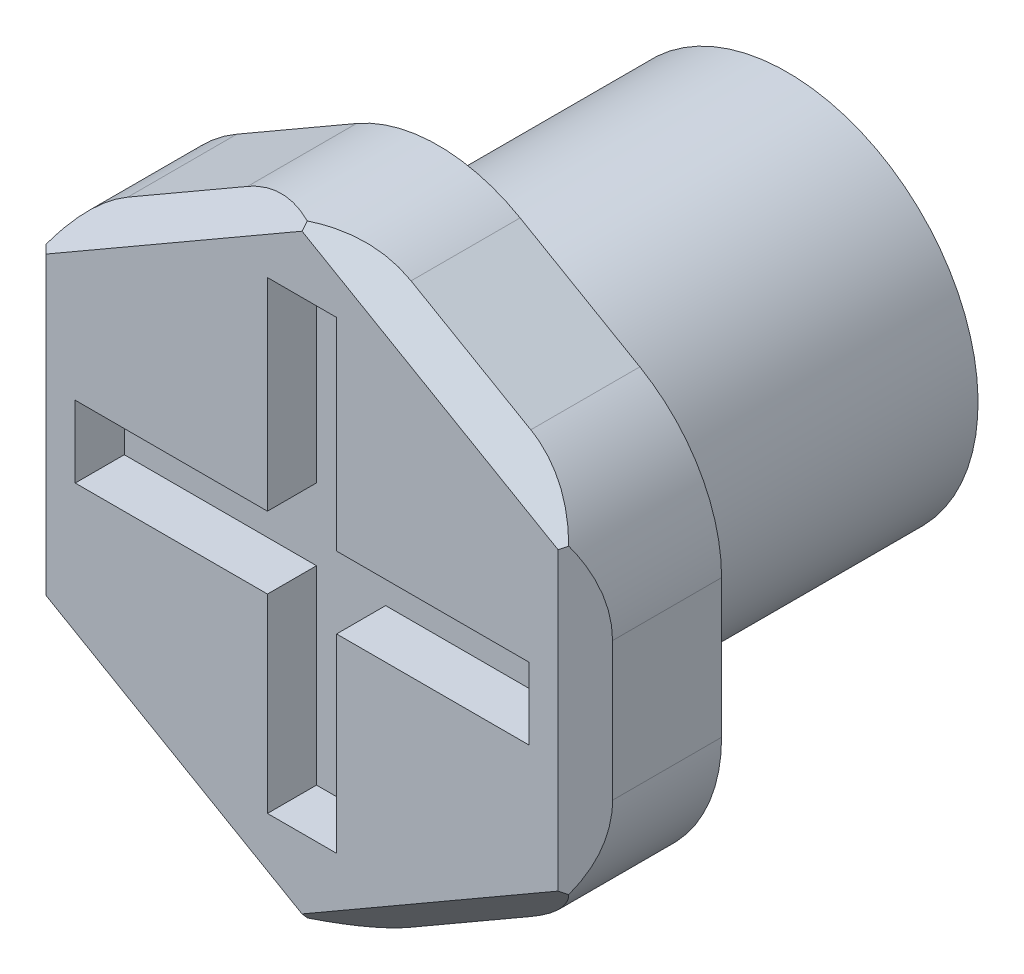
ISO-10303-21;
HEADER;
FILE_DESCRIPTION(('STEP AP214'),'2;1');
FILE_NAME('part.step','',(''),(''),'','','');
FILE_SCHEMA(('AUTOMOTIVE_DESIGN { 1 0 10303 214 1 1 1 1 }'));
ENDSEC;
DATA;
#1=APPLICATION_CONTEXT('core data for automotive mechanical design processes');
#2=APPLICATION_PROTOCOL_DEFINITION('international standard','automotive_design',2000,#1);
#3=PRODUCT_CONTEXT('',#1,'mechanical');
#4=PRODUCT('Part','Part','',(#3));
#5=PRODUCT_RELATED_PRODUCT_CATEGORY('part','',(#4));
#6=PRODUCT_DEFINITION_FORMATION('','',#4);
#7=PRODUCT_DEFINITION_CONTEXT('part definition',#1,'design');
#8=PRODUCT_DEFINITION('design','',#6,#7);
#9=PRODUCT_DEFINITION_SHAPE('','',#8);
#10=(LENGTH_UNIT() NAMED_UNIT(*) SI_UNIT(.MILLI.,.METRE.));
#11=(NAMED_UNIT(*) PLANE_ANGLE_UNIT() SI_UNIT($,.RADIAN.));
#12=(NAMED_UNIT(*) SI_UNIT($,.STERADIAN.) SOLID_ANGLE_UNIT());
#13=UNCERTAINTY_MEASURE_WITH_UNIT(LENGTH_MEASURE(1.E-05),#10,'distance_accuracy_value','');
#14=(GEOMETRIC_REPRESENTATION_CONTEXT(3) GLOBAL_UNCERTAINTY_ASSIGNED_CONTEXT((#13)) GLOBAL_UNIT_ASSIGNED_CONTEXT((#10,
#11,#12)) REPRESENTATION_CONTEXT('',''));
#15=CARTESIAN_POINT('',(0.,0.,0.));
#16=DIRECTION('',(0.,0.,1.));
#17=DIRECTION('',(1.,0.,0.));
#18=AXIS2_PLACEMENT_3D('',#15,#16,#17);
#19=CARTESIAN_POINT('',(-5.2828629166,-5.2618340026,2.032));
#20=DIRECTION('',(0.,0.,1.));
#21=DIRECTION('',(1.,0.,0.));
#22=AXIS2_PLACEMENT_3D('',#19,#20,#21);
#23=PLANE('',#22);
#24=DIRECTION('',(0.,1.,0.));
#25=VECTOR('',#24,1.);
#26=CARTESIAN_POINT('',(-0.8049227234,3.1925308006,2.032));
#27=LINE('',#26,#25);
#28=CARTESIAN_POINT('',(-0.804922722928895,0.835675141292319,2.032));
#29=VERTEX_POINT('',#28);
#30=CARTESIAN_POINT('',(-0.804922722928895,5.5493864628,2.032));
#31=VERTEX_POINT('',#30);
#32=EDGE_CURVE('E239',#29,#31,#27,.T.);
#33=ORIENTED_EDGE('',*,*,#32,.F.);
#34=DIRECTION('',(1.,0.,0.));
#35=VECTOR('',#34,1.);
#36=CARTESIAN_POINT('',(-3.04389282,0.8356751384,2.032));
#37=LINE('',#36,#35);
#38=CARTESIAN_POINT('',(-5.2828629166,0.835675141292319,2.032));
#39=VERTEX_POINT('',#38);
#40=EDGE_CURVE('E237',#39,#29,#37,.T.);
#41=ORIENTED_EDGE('',*,*,#40,.F.);
#42=DIRECTION('',(0.,-1.,0.));
#43=VECTOR('',#42,1.);
#44=CARTESIAN_POINT('',(-5.2828629166,0.,2.032));
#45=LINE('',#44,#43);
#46=CARTESIAN_POINT('',(-5.2828629166,-0.835675136685313,2.032));
#47=VERTEX_POINT('',#46);
#48=EDGE_CURVE('E228',#39,#47,#45,.T.);
#49=ORIENTED_EDGE('',*,*,#48,.T.);
#50=DIRECTION('',(1.,0.,0.));
#51=VECTOR('',#50,1.);
#52=CARTESIAN_POINT('',(-3.04389282,-0.8356751384,2.032));
#53=LINE('',#52,#51);
#54=CARTESIAN_POINT('',(-0.80492272245779,-0.835675134970626,2.032));
#55=VERTEX_POINT('',#54);
#56=EDGE_CURVE('E197',#47,#55,#53,.T.);
#57=ORIENTED_EDGE('',*,*,#56,.T.);
#58=DIRECTION('',(0.,1.,0.));
#59=VECTOR('',#58,1.);
#60=CARTESIAN_POINT('',(-0.8049227234,-3.0487545705,2.032));
#61=LINE('',#60,#59);
#62=CARTESIAN_POINT('',(-0.804922722928895,-5.2618340026,2.032));
#63=VERTEX_POINT('',#62);
#64=EDGE_CURVE('E285',#63,#55,#61,.T.);
#65=ORIENTED_EDGE('',*,*,#64,.F.);
#66=DIRECTION('',(1.,0.,0.));
#67=VECTOR('',#66,1.);
#68=CARTESIAN_POINT('',(0.,-5.2618340026,2.032));
#69=LINE('',#68,#67);
#70=CARTESIAN_POINT('',(0.80492272245779,-5.2618340026,2.032));
#71=VERTEX_POINT('',#70);
#72=EDGE_CURVE('E279',#63,#71,#69,.T.);
#73=ORIENTED_EDGE('',*,*,#72,.T.);
#74=DIRECTION('',(0.,1.,0.));
#75=VECTOR('',#74,1.);
#76=CARTESIAN_POINT('',(0.8049227234,-3.0487545705,2.032));
#77=LINE('',#76,#75);
#78=CARTESIAN_POINT('',(0.80492272245779,-0.835675134970626,2.032));
#79=VERTEX_POINT('',#78);
#80=EDGE_CURVE('E275',#71,#79,#77,.T.);
#81=ORIENTED_EDGE('',*,*,#80,.T.);
#82=DIRECTION('',(1.,0.,0.));
#83=VECTOR('',#82,1.);
#84=CARTESIAN_POINT('',(3.04389282,-0.8356751384,2.032));
#85=LINE('',#84,#83);
#86=CARTESIAN_POINT('',(5.2828629166,-0.835675134970626,2.032));
#87=VERTEX_POINT('',#86);
#88=EDGE_CURVE('E270',#79,#87,#85,.T.);
#89=ORIENTED_EDGE('',*,*,#88,.T.);
#90=DIRECTION('',(0.,-1.,0.));
#91=VECTOR('',#90,1.);
#92=CARTESIAN_POINT('',(5.2828629166,0.,2.032));
#93=LINE('',#92,#91);
#94=CARTESIAN_POINT('',(5.2828629166,0.835675141292319,2.032));
#95=VERTEX_POINT('',#94);
#96=EDGE_CURVE('E267',#95,#87,#93,.T.);
#97=ORIENTED_EDGE('',*,*,#96,.F.);
#98=DIRECTION('',(1.,0.,0.));
#99=VECTOR('',#98,1.);
#100=CARTESIAN_POINT('',(3.04389282,0.8356751384,2.032));
#101=LINE('',#100,#99);
#102=CARTESIAN_POINT('',(0.804922722928895,0.835675141292319,2.032));
#103=VERTEX_POINT('',#102);
#104=EDGE_CURVE('E262',#103,#95,#101,.T.);
#105=ORIENTED_EDGE('',*,*,#104,.F.);
#106=DIRECTION('',(0.,1.,0.));
#107=VECTOR('',#106,1.);
#108=CARTESIAN_POINT('',(0.8049227234,3.1925308006,2.032));
#109=LINE('',#108,#107);
#110=CARTESIAN_POINT('',(0.80492272245779,5.5493864628,2.032));
#111=VERTEX_POINT('',#110);
#112=EDGE_CURVE('E255',#103,#111,#109,.T.);
#113=ORIENTED_EDGE('',*,*,#112,.T.);
#114=DIRECTION('',(1.,0.,0.));
#115=VECTOR('',#114,1.);
#116=CARTESIAN_POINT('',(0.,5.5493864628,2.032));
#117=LINE('',#116,#115);
#118=EDGE_CURVE('E252',#31,#111,#117,.T.);
#119=ORIENTED_EDGE('',*,*,#118,.F.);
#120=EDGE_LOOP('',(#33,#41,#49,#57,#65,#73,#81,#89,#97,#105,#113,#119));
#121=FACE_BOUND('',#120,.T.);
#122=ADVANCED_FACE('F16',(#121),#23,.T.);
#123=CARTESIAN_POINT('',(-5.2828629166,-0.8356751384,2.032));
#124=DIRECTION('',(-1.,0.,0.));
#125=DIRECTION('',(0.,0.,1.));
#126=AXIS2_PLACEMENT_3D('',#123,#124,#125);
#127=PLANE('',#126);
#128=DIRECTION('',(0.,0.,-1.));
#129=VECTOR('',#128,1.);
#130=CARTESIAN_POINT('',(-5.2828629166,-0.8356751384,2.6035));
#131=LINE('',#130,#129);
#132=CARTESIAN_POINT('',(-5.28286291624662,-0.835675138634561,3.175));
#133=VERTEX_POINT('',#132);
#134=EDGE_CURVE('E234',#133,#47,#131,.T.);
#135=ORIENTED_EDGE('',*,*,#134,.T.);
#136=ORIENTED_EDGE('',*,*,#48,.F.);
#137=DIRECTION('',(0.,0.,-1.));
#138=VECTOR('',#137,1.);
#139=CARTESIAN_POINT('',(-5.2828629166,0.8356751384,2.6035));
#140=LINE('',#139,#138);
#141=CARTESIAN_POINT('',(-5.28286291624662,0.835675138634562,3.175));
#142=VERTEX_POINT('',#141);
#143=EDGE_CURVE('E232',#142,#39,#140,.T.);
#144=ORIENTED_EDGE('',*,*,#143,.F.);
#145=DIRECTION('',(0.,1.,0.));
#146=VECTOR('',#145,1.);
#147=CARTESIAN_POINT('',(-5.28286291518647,0.,3.175));
#148=LINE('',#147,#146);
#149=EDGE_CURVE('E190',#133,#142,#148,.T.);
#150=ORIENTED_EDGE('',*,*,#149,.F.);
#151=EDGE_LOOP('',(#135,#136,#144,#150));
#152=FACE_BOUND('',#151,.T.);
#153=ADVANCED_FACE('F230',(#152),#127,.F.);
#154=CARTESIAN_POINT('',(-5.2828629166,0.8356751384,3.175));
#155=DIRECTION('',(0.,-1.,0.));
#156=DIRECTION('',(0.,0.,-1.));
#157=AXIS2_PLACEMENT_3D('',#154,#155,#156);
#158=PLANE('',#157);
#159=ORIENTED_EDGE('',*,*,#40,.T.);
#160=DIRECTION('',(0.,0.,-1.));
#161=VECTOR('',#160,1.);
#162=CARTESIAN_POINT('',(-0.8049227234,0.8356751384,2.6035));
#163=LINE('',#162,#161);
#164=CARTESIAN_POINT('',(-0.804922722562853,0.835675138634562,3.175));
#165=VERTEX_POINT('',#164);
#166=EDGE_CURVE('E242',#165,#29,#163,.T.);
#167=ORIENTED_EDGE('',*,*,#166,.F.);
#168=DIRECTION('',(1.,0.,0.));
#169=VECTOR('',#168,1.);
#170=CARTESIAN_POINT('',(0.,0.835675139338246,3.175));
#171=LINE('',#170,#169);
#172=EDGE_CURVE('E246',#142,#165,#171,.T.);
#173=ORIENTED_EDGE('',*,*,#172,.F.);
#174=ORIENTED_EDGE('',*,*,#143,.T.);
#175=EDGE_LOOP('',(#159,#167,#173,#174));
#176=FACE_BOUND('',#175,.T.);
#177=ADVANCED_FACE('F244',(#176),#158,.T.);
#178=CARTESIAN_POINT('',(-0.8049227234,0.8356751384,3.175));
#179=DIRECTION('',(1.,0.,0.));
#180=DIRECTION('',(0.,0.,-1.));
#181=AXIS2_PLACEMENT_3D('',#178,#179,#180);
#182=PLANE('',#181);
#183=ORIENTED_EDGE('',*,*,#32,.T.);
#184=DIRECTION('',(0.,0.,-1.));
#185=VECTOR('',#184,1.);
#186=CARTESIAN_POINT('',(-0.8049227234,5.5493864628,2.6035));
#187=LINE('',#186,#185);
#188=CARTESIAN_POINT('',(-0.804922722562853,5.54938646227071,3.175));
#189=VERTEX_POINT('',#188);
#190=EDGE_CURVE('E250',#189,#31,#187,.T.);
#191=ORIENTED_EDGE('',*,*,#190,.F.);
#192=DIRECTION('',(0.,1.,0.));
#193=VECTOR('',#192,1.);
#194=CARTESIAN_POINT('',(-0.80492272005141,0.,3.175));
#195=LINE('',#194,#193);
#196=EDGE_CURVE('E319',#165,#189,#195,.T.);
#197=ORIENTED_EDGE('',*,*,#196,.F.);
#198=ORIENTED_EDGE('',*,*,#166,.T.);
#199=EDGE_LOOP('',(#183,#191,#197,#198));
#200=FACE_BOUND('',#199,.T.);
#201=ADVANCED_FACE('F558',(#200),#182,.T.);
#202=CARTESIAN_POINT('',(-0.8049227234,5.5493864628,3.175));
#203=DIRECTION('',(0.,-1.,0.));
#204=DIRECTION('',(0.,0.,-1.));
#205=AXIS2_PLACEMENT_3D('',#202,#203,#204);
#206=PLANE('',#205);
#207=ORIENTED_EDGE('',*,*,#118,.T.);
#208=DIRECTION('',(0.,0.,1.));
#209=VECTOR('',#208,1.);
#210=CARTESIAN_POINT('',(0.8049227234,5.5493864628,2.6035));
#211=LINE('',#210,#209);
#212=CARTESIAN_POINT('',(0.804922722562853,5.54938646227071,3.175));
#213=VERTEX_POINT('',#212);
#214=EDGE_CURVE('E258',#111,#213,#211,.T.);
#215=ORIENTED_EDGE('',*,*,#214,.T.);
#216=DIRECTION('',(1.,0.,0.));
#217=VECTOR('',#216,1.);
#218=CARTESIAN_POINT('',(0.,5.54938646068282,3.175));
#219=LINE('',#218,#217);
#220=EDGE_CURVE('E316',#189,#213,#219,.T.);
#221=ORIENTED_EDGE('',*,*,#220,.F.);
#222=ORIENTED_EDGE('',*,*,#190,.T.);
#223=EDGE_LOOP('',(#207,#215,#221,#222));
#224=FACE_BOUND('',#223,.T.);
#225=ADVANCED_FACE('F561',(#224),#206,.T.);
#226=CARTESIAN_POINT('',(0.8049227234,0.8356751384,3.175));
#227=DIRECTION('',(1.,0.,0.));
#228=DIRECTION('',(0.,0.,-1.));
#229=AXIS2_PLACEMENT_3D('',#226,#227,#228);
#230=PLANE('',#229);
#231=ORIENTED_EDGE('',*,*,#214,.F.);
#232=ORIENTED_EDGE('',*,*,#112,.F.);
#233=DIRECTION('',(0.,0.,-1.));
#234=VECTOR('',#233,1.);
#235=CARTESIAN_POINT('',(0.8049227234,0.8356751384,2.6035));
#236=LINE('',#235,#234);
#237=CARTESIAN_POINT('',(0.804922722562853,0.835675138634562,3.175));
#238=VERTEX_POINT('',#237);
#239=EDGE_CURVE('E260',#238,#103,#236,.T.);
#240=ORIENTED_EDGE('',*,*,#239,.F.);
#241=DIRECTION('',(0.,-1.,0.));
#242=VECTOR('',#241,1.);
#243=CARTESIAN_POINT('',(0.80492272005141,0.,3.175));
#244=LINE('',#243,#242);
#245=EDGE_CURVE('E313',#213,#238,#244,.T.);
#246=ORIENTED_EDGE('',*,*,#245,.F.);
#247=EDGE_LOOP('',(#231,#232,#240,#246));
#248=FACE_BOUND('',#247,.T.);
#249=ADVANCED_FACE('F565',(#248),#230,.F.);
#250=CARTESIAN_POINT('',(0.8049227234,0.8356751384,3.175));
#251=DIRECTION('',(0.,-1.,0.));
#252=DIRECTION('',(0.,0.,-1.));
#253=AXIS2_PLACEMENT_3D('',#250,#251,#252);
#254=PLANE('',#253);
#255=ORIENTED_EDGE('',*,*,#104,.T.);
#256=DIRECTION('',(0.,0.,-1.));
#257=VECTOR('',#256,1.);
#258=CARTESIAN_POINT('',(5.2828629166,0.8356751384,2.6035));
#259=LINE('',#258,#257);
#260=CARTESIAN_POINT('',(5.28286291624662,0.835675138634562,3.175));
#261=VERTEX_POINT('',#260);
#262=EDGE_CURVE('E264',#261,#95,#259,.T.);
#263=ORIENTED_EDGE('',*,*,#262,.F.);
#264=DIRECTION('',(1.,0.,0.));
#265=VECTOR('',#264,1.);
#266=CARTESIAN_POINT('',(0.,0.835675139338246,3.175));
#267=LINE('',#266,#265);
#268=EDGE_CURVE('E310',#238,#261,#267,.T.);
#269=ORIENTED_EDGE('',*,*,#268,.F.);
#270=ORIENTED_EDGE('',*,*,#239,.T.);
#271=EDGE_LOOP('',(#255,#263,#269,#270));
#272=FACE_BOUND('',#271,.T.);
#273=ADVANCED_FACE('F569',(#272),#254,.T.);
#274=CARTESIAN_POINT('',(5.2828629166,-0.8356751384,2.032));
#275=DIRECTION('',(-1.,0.,0.));
#276=DIRECTION('',(0.,0.,1.));
#277=AXIS2_PLACEMENT_3D('',#274,#275,#276);
#278=PLANE('',#277);
#279=ORIENTED_EDGE('',*,*,#96,.T.);
#280=DIRECTION('',(0.,0.,1.));
#281=VECTOR('',#280,1.);
#282=CARTESIAN_POINT('',(5.2828629166,-0.8356751384,2.6035));
#283=LINE('',#282,#281);
#284=CARTESIAN_POINT('',(5.28286291624662,-0.835675138634561,3.175));
#285=VERTEX_POINT('',#284);
#286=EDGE_CURVE('E273',#87,#285,#283,.T.);
#287=ORIENTED_EDGE('',*,*,#286,.T.);
#288=DIRECTION('',(0.,-1.,0.));
#289=VECTOR('',#288,1.);
#290=CARTESIAN_POINT('',(5.28286291518647,0.,3.175));
#291=LINE('',#290,#289);
#292=EDGE_CURVE('E307',#261,#285,#291,.T.);
#293=ORIENTED_EDGE('',*,*,#292,.F.);
#294=ORIENTED_EDGE('',*,*,#262,.T.);
#295=EDGE_LOOP('',(#279,#287,#293,#294));
#296=FACE_BOUND('',#295,.T.);
#297=ADVANCED_FACE('F573',(#296),#278,.T.);
#298=CARTESIAN_POINT('',(0.8049227234,-0.8356751384,3.175));
#299=DIRECTION('',(0.,-1.,0.));
#300=DIRECTION('',(0.,0.,-1.));
#301=AXIS2_PLACEMENT_3D('',#298,#299,#300);
#302=PLANE('',#301);
#303=ORIENTED_EDGE('',*,*,#286,.F.);
#304=ORIENTED_EDGE('',*,*,#88,.F.);
#305=DIRECTION('',(0.,0.,1.));
#306=VECTOR('',#305,1.);
#307=CARTESIAN_POINT('',(0.8049227234,-0.8356751384,2.6035));
#308=LINE('',#307,#306);
#309=CARTESIAN_POINT('',(0.804922722562853,-0.835675138634561,3.175));
#310=VERTEX_POINT('',#309);
#311=EDGE_CURVE('E277',#79,#310,#308,.T.);
#312=ORIENTED_EDGE('',*,*,#311,.T.);
#313=DIRECTION('',(-1.,0.,0.));
#314=VECTOR('',#313,1.);
#315=CARTESIAN_POINT('',(0.,-0.835675139338245,3.175));
#316=LINE('',#315,#314);
#317=EDGE_CURVE('E304',#285,#310,#316,.T.);
#318=ORIENTED_EDGE('',*,*,#317,.F.);
#319=EDGE_LOOP('',(#303,#304,#312,#318));
#320=FACE_BOUND('',#319,.T.);
#321=ADVANCED_FACE('F577',(#320),#302,.F.);
#322=CARTESIAN_POINT('',(0.8049227234,-5.2618340026,3.175));
#323=DIRECTION('',(1.,0.,0.));
#324=DIRECTION('',(0.,0.,-1.));
#325=AXIS2_PLACEMENT_3D('',#322,#323,#324);
#326=PLANE('',#325);
#327=ORIENTED_EDGE('',*,*,#311,.F.);
#328=ORIENTED_EDGE('',*,*,#80,.F.);
#329=DIRECTION('',(0.,0.,1.));
#330=VECTOR('',#329,1.);
#331=CARTESIAN_POINT('',(0.8049227234,-5.2618340026,2.6035));
#332=LINE('',#331,#330);
#333=CARTESIAN_POINT('',(0.804922722562853,-5.26183400597365,3.175));
#334=VERTEX_POINT('',#333);
#335=EDGE_CURVE('E281',#71,#334,#332,.T.);
#336=ORIENTED_EDGE('',*,*,#335,.T.);
#337=DIRECTION('',(0.,-1.,0.));
#338=VECTOR('',#337,1.);
#339=CARTESIAN_POINT('',(0.80492272005141,0.,3.175));
#340=LINE('',#339,#338);
#341=EDGE_CURVE('E301',#310,#334,#340,.T.);
#342=ORIENTED_EDGE('',*,*,#341,.F.);
#343=EDGE_LOOP('',(#327,#328,#336,#342));
#344=FACE_BOUND('',#343,.T.);
#345=ADVANCED_FACE('F581',(#344),#326,.F.);
#346=CARTESIAN_POINT('',(-0.8049227234,-5.2618340026,3.175));
#347=DIRECTION('',(0.,-1.,0.));
#348=DIRECTION('',(0.,0.,-1.));
#349=AXIS2_PLACEMENT_3D('',#346,#347,#348);
#350=PLANE('',#349);
#351=ORIENTED_EDGE('',*,*,#335,.F.);
#352=ORIENTED_EDGE('',*,*,#72,.F.);
#353=DIRECTION('',(0.,0.,-1.));
#354=VECTOR('',#353,1.);
#355=CARTESIAN_POINT('',(-0.8049227234,-5.2618340026,2.6035));
#356=LINE('',#355,#354);
#357=CARTESIAN_POINT('',(-0.804922722562853,-5.26183400597365,3.175));
#358=VERTEX_POINT('',#357);
#359=EDGE_CURVE('E283',#358,#63,#356,.T.);
#360=ORIENTED_EDGE('',*,*,#359,.F.);
#361=DIRECTION('',(-1.,0.,0.));
#362=VECTOR('',#361,1.);
#363=CARTESIAN_POINT('',(0.,-5.26183401609459,3.175));
#364=LINE('',#363,#362);
#365=EDGE_CURVE('E298',#334,#358,#364,.T.);
#366=ORIENTED_EDGE('',*,*,#365,.F.);
#367=EDGE_LOOP('',(#351,#352,#360,#366));
#368=FACE_BOUND('',#367,.T.);
#369=ADVANCED_FACE('F585',(#368),#350,.F.);
#370=CARTESIAN_POINT('',(-0.8049227234,-5.2618340026,3.175));
#371=DIRECTION('',(1.,0.,0.));
#372=DIRECTION('',(0.,0.,-1.));
#373=AXIS2_PLACEMENT_3D('',#370,#371,#372);
#374=PLANE('',#373);
#375=ORIENTED_EDGE('',*,*,#64,.T.);
#376=DIRECTION('',(0.,0.,1.));
#377=VECTOR('',#376,1.);
#378=CARTESIAN_POINT('',(-0.8049227234,-0.8356751384,2.6035));
#379=LINE('',#378,#377);
#380=CARTESIAN_POINT('',(-0.804922722562853,-0.835675138634561,3.175));
#381=VERTEX_POINT('',#380);
#382=EDGE_CURVE('E152',#55,#381,#379,.T.);
#383=ORIENTED_EDGE('',*,*,#382,.T.);
#384=DIRECTION('',(0.,1.,0.));
#385=VECTOR('',#384,1.);
#386=CARTESIAN_POINT('',(-0.80492272005141,0.,3.175));
#387=LINE('',#386,#385);
#388=EDGE_CURVE('E295',#358,#381,#387,.T.);
#389=ORIENTED_EDGE('',*,*,#388,.F.);
#390=ORIENTED_EDGE('',*,*,#359,.T.);
#391=EDGE_LOOP('',(#375,#383,#389,#390));
#392=FACE_BOUND('',#391,.T.);
#393=ADVANCED_FACE('F589',(#392),#374,.T.);
#394=CARTESIAN_POINT('',(-5.2828629166,-0.8356751384,3.175));
#395=DIRECTION('',(0.,-1.,0.));
#396=DIRECTION('',(0.,0.,-1.));
#397=AXIS2_PLACEMENT_3D('',#394,#395,#396);
#398=PLANE('',#397);
#399=ORIENTED_EDGE('',*,*,#382,.F.);
#400=ORIENTED_EDGE('',*,*,#56,.F.);
#401=ORIENTED_EDGE('',*,*,#134,.F.);
#402=DIRECTION('',(-1.,0.,0.));
#403=VECTOR('',#402,1.);
#404=CARTESIAN_POINT('',(0.,-0.835675139338245,3.175));
#405=LINE('',#404,#403);
#406=EDGE_CURVE('E292',#381,#133,#405,.T.);
#407=ORIENTED_EDGE('',*,*,#406,.F.);
#408=EDGE_LOOP('',(#399,#400,#401,#407));
#409=FACE_BOUND('',#408,.T.);
#410=ADVANCED_FACE('F593',(#409),#398,.F.);
#411=CARTESIAN_POINT('',(-5.9641135734,-6.8867651698,3.175));
#412=DIRECTION('',(0.,0.,1.));
#413=DIRECTION('',(1.,0.,0.));
#414=AXIS2_PLACEMENT_3D('',#411,#412,#413);
#415=PLANE('',#414);
#416=ORIENTED_EDGE('',*,*,#388,.T.);
#417=ORIENTED_EDGE('',*,*,#406,.T.);
#418=ORIENTED_EDGE('',*,*,#149,.T.);
#419=ORIENTED_EDGE('',*,*,#172,.T.);
#420=ORIENTED_EDGE('',*,*,#196,.T.);
#421=ORIENTED_EDGE('',*,*,#220,.T.);
#422=ORIENTED_EDGE('',*,*,#245,.T.);
#423=ORIENTED_EDGE('',*,*,#268,.T.);
#424=ORIENTED_EDGE('',*,*,#292,.T.);
#425=ORIENTED_EDGE('',*,*,#317,.T.);
#426=ORIENTED_EDGE('',*,*,#341,.T.);
#427=ORIENTED_EDGE('',*,*,#365,.T.);
#428=EDGE_LOOP('',(#416,#417,#418,#419,#420,#421,#422,#423,#424,#425,#426,#427));
#429=FACE_BOUND('',#428,.T.);
#430=DIRECTION('',(0.,-1.,0.));
#431=VECTOR('',#430,1.);
#432=CARTESIAN_POINT('',(5.9641135734,0.,3.175));
#433=LINE('',#432,#431);
#434=CARTESIAN_POINT('',(5.9641135734,3.44338257355097,3.175));
#435=VERTEX_POINT('',#434);
#436=CARTESIAN_POINT('',(5.9641135734,-3.44338257355097,3.175));
#437=VERTEX_POINT('',#436);
#438=EDGE_CURVE('E392',#435,#437,#433,.T.);
#439=ORIENTED_EDGE('',*,*,#438,.F.);
#440=DIRECTION('',(0.866025404100274,-0.499999999452957,0.));
#441=VECTOR('',#440,1.);
#442=CARTESIAN_POINT('',(2.9820567867,5.1650738583,3.175));
#443=LINE('',#442,#441);
#444=CARTESIAN_POINT('',(1.2009651086109E-09,6.8867651450218,3.175));
#445=VERTEX_POINT('',#444);
#446=EDGE_CURVE('E143',#445,#435,#443,.T.);
#447=ORIENTED_EDGE('',*,*,#446,.F.);
#448=DIRECTION('',(0.866025404100274,0.499999999452957,0.));
#449=VECTOR('',#448,1.);
#450=CARTESIAN_POINT('',(-2.9820567867,5.1650738583,3.175));
#451=LINE('',#450,#449);
#452=CARTESIAN_POINT('',(-5.9641135734,3.44338257355097,3.175));
#453=VERTEX_POINT('',#452);
#454=EDGE_CURVE('E391',#453,#445,#451,.T.);
#455=ORIENTED_EDGE('',*,*,#454,.F.);
#456=DIRECTION('',(0.,1.,0.));
#457=VECTOR('',#456,1.);
#458=CARTESIAN_POINT('',(-5.9641135734,0.,3.175));
#459=LINE('',#458,#457);
#460=CARTESIAN_POINT('',(-5.96411357460097,-3.4433825715782,3.175));
#461=VERTEX_POINT('',#460);
#462=EDGE_CURVE('E406',#461,#453,#459,.T.);
#463=ORIENTED_EDGE('',*,*,#462,.F.);
#464=DIRECTION('',(-0.866025404100274,0.499999999452957,0.));
#465=VECTOR('',#464,1.);
#466=CARTESIAN_POINT('',(-2.9820567867,-5.1650738583,3.175));
#467=LINE('',#466,#465);
#468=CARTESIAN_POINT('',(-1.2009651086109E-09,-6.8867651450218,3.175));
#469=VERTEX_POINT('',#468);
#470=EDGE_CURVE('E402',#469,#461,#467,.T.);
#471=ORIENTED_EDGE('',*,*,#470,.F.);
#472=DIRECTION('',(-0.866025404100274,-0.499999999452957,0.));
#473=VECTOR('',#472,1.);
#474=CARTESIAN_POINT('',(2.9820567867,-5.1650738583,3.175));
#475=LINE('',#474,#473);
#476=EDGE_CURVE('E397',#437,#469,#475,.T.);
#477=ORIENTED_EDGE('',*,*,#476,.F.);
#478=EDGE_LOOP('',(#439,#447,#455,#463,#471,#477));
#479=FACE_BOUND('',#478,.T.);
#480=ADVANCED_FACE('F481',(#429,#479),#415,.T.);
#481=CARTESIAN_POINT('',(-0.0988104196,6.9438133666,3.175));
#482=DIRECTION('',(0.353553384662103,0.612372426316024,0.707106792275252));
#483=DIRECTION('',(0.866025404100274,-0.499999999452957,0.));
#484=AXIS2_PLACEMENT_3D('',#481,#482,#483);
#485=PLANE('',#484);
#486=DIRECTION('',(-0.654653672081056,-0.377964468252746,0.654653672081054));
#487=VECTOR('',#486,1.);
#488=CARTESIAN_POINT('',(6.088670362005,3.51529546920503,3.050443211395));
#489=LINE('',#488,#487);
#490=CARTESIAN_POINT('',(6.08867036513835,3.51529547101407,3.05044320826165));
#491=VERTEX_POINT('',#490);
#492=EDGE_CURVE('E396',#491,#435,#489,.T.);
#493=ORIENTED_EDGE('',*,*,#492,.F.);
#494=CARTESIAN_POINT('',(2.7891135734,1.610295484,6.34999988505512));
#495=DIRECTION('',(0.353553384662103,0.612372426316024,0.707106792275252));
#496=DIRECTION('',(0.353553395750808,0.612372445522224,-0.707106770097843));
#497=AXIS2_PLACEMENT_3D('',#494,#495,#496);
#498=ELLIPSE('',#497,5.38815358814556,3.81);
#499=CARTESIAN_POINT('',(4.69411357854481,4.909852262239,2.54000001079389));
#500=VERTEX_POINT('',#499);
#501=EDGE_CURVE('E395',#491,#500,#498,.T.);
#502=ORIENTED_EDGE('',*,*,#501,.T.);
#503=DIRECTION('',(-0.866025402225197,0.500000002700685,0.));
#504=VECTOR('',#503,1.);
#505=CARTESIAN_POINT('',(3.2995567867,5.715,2.54));
#506=LINE('',#505,#504);
#507=CARTESIAN_POINT('',(1.90499999935131,6.52014773688387,2.54000000723487));
#508=VERTEX_POINT('',#507);
#509=EDGE_CURVE('E380',#500,#508,#506,.T.);
#510=ORIENTED_EDGE('',*,*,#509,.T.);
#511=CARTESIAN_POINT('',(0.,3.2205909426,6.34999989497445));
#512=DIRECTION('',(0.353553384662103,0.612372426316024,0.707106792275252));
#513=DIRECTION('',(0.353553395750808,0.612372445522224,-0.707106770097843));
#514=AXIS2_PLACEMENT_3D('',#511,#512,#513);
#515=ELLIPSE('',#514,5.38815358814556,3.81);
#516=CARTESIAN_POINT('',(2.6507148018794E-09,7.03059094063617,3.05044320754968));
#517=VERTEX_POINT('',#516);
#518=EDGE_CURVE('E372',#508,#517,#515,.T.);
#519=ORIENTED_EDGE('',*,*,#518,.T.);
#520=DIRECTION('',(1.30757816256895E-09,0.755928945162061,-0.654653671696855));
#521=VECTOR('',#520,1.);
#522=CARTESIAN_POINT('',(2.40193021722179E-09,6.88676514571518,3.175));
#523=LINE('',#522,#521);
#524=EDGE_CURVE('E20',#445,#517,#523,.T.);
#525=ORIENTED_EDGE('',*,*,#524,.F.);
#526=ORIENTED_EDGE('',*,*,#446,.T.);
#527=EDGE_LOOP('',(#493,#502,#510,#519,#525,#526));
#528=FACE_BOUND('',#527,.T.);
#529=ADVANCED_FACE('F486',(#528),#485,.T.);
#530=CARTESIAN_POINT('',(-6.062923993,3.38633435,3.175));
#531=DIRECTION('',(-0.353553390785827,0.612372436922624,0.707106780027805));
#532=DIRECTION('',(0.866025404100274,0.499999999452957,0.));
#533=AXIS2_PLACEMENT_3D('',#530,#531,#532);
#534=PLANE('',#533);
#535=ORIENTED_EDGE('',*,*,#524,.T.);
#536=CARTESIAN_POINT('',(0.,3.2205909426,6.35000000495966));
#537=DIRECTION('',(-0.353553390785827,0.612372436922624,0.707106780027805));
#538=DIRECTION('',(-0.353553389627085,0.612372434915624,-0.70710678234529));
#539=AXIS2_PLACEMENT_3D('',#536,#537,#538);
#540=ELLIPSE('',#539,5.38815368147111,3.81);
#541=CARTESIAN_POINT('',(-1.90500000514481,6.520147733539,2.53999998771766));
#542=VERTEX_POINT('',#541);
#543=EDGE_CURVE('E376',#517,#542,#540,.T.);
#544=ORIENTED_EDGE('',*,*,#543,.T.);
#545=DIRECTION('',(-0.866025402225197,-0.500000002700685,0.));
#546=VECTOR('',#545,1.);
#547=CARTESIAN_POINT('',(-3.2995567867,5.715,2.54));
#548=LINE('',#547,#546);
#549=CARTESIAN_POINT('',(-4.69411357372434,4.9098522650221,2.53999999127668));
#550=VERTEX_POINT('',#549);
#551=EDGE_CURVE('E371',#542,#550,#548,.T.);
#552=ORIENTED_EDGE('',*,*,#551,.T.);
#553=CARTESIAN_POINT('',(-2.7891135734,1.610295484,6.34999999504033));
#554=DIRECTION('',(-0.353553390785827,0.612372436922624,0.707106780027805));
#555=DIRECTION('',(-0.353553389627085,0.612372434915624,-0.70710678234529));
#556=AXIS2_PLACEMENT_3D('',#553,#554,#555);
#557=ELLIPSE('',#556,5.38815368147111,3.81);
#558=CARTESIAN_POINT('',(-6.08867036555445,3.51529547029336,3.05044320784555));
#559=VERTEX_POINT('',#558);
#560=EDGE_CURVE('E363',#550,#559,#557,.T.);
#561=ORIENTED_EDGE('',*,*,#560,.T.);
#562=DIRECTION('',(-0.654653672081056,0.377964468252748,-0.654653672081053));
#563=VECTOR('',#562,1.);
#564=CARTESIAN_POINT('',(-5.9641135734,3.44338257483035,3.175));
#565=LINE('',#564,#563);
#566=EDGE_CURVE('E405',#453,#559,#565,.T.);
#567=ORIENTED_EDGE('',*,*,#566,.F.);
#568=ORIENTED_EDGE('',*,*,#454,.T.);
#569=EDGE_LOOP('',(#535,#544,#552,#561,#567,#568));
#570=FACE_BOUND('',#569,.T.);
#571=ADVANCED_FACE('F460',(#570),#534,.T.);
#572=CARTESIAN_POINT('',(-5.9641135734,-3.5574790166,3.175));
#573=DIRECTION('',(-0.707106781186546,0.,0.707106781186549));
#574=DIRECTION('',(0.,1.,0.));
#575=AXIS2_PLACEMENT_3D('',#572,#573,#574);
#576=PLANE('',#575);
#577=ORIENTED_EDGE('',*,*,#566,.T.);
#578=CARTESIAN_POINT('',(-2.7891135734,1.610295484,6.34999999999999));
#579=DIRECTION('',(-0.707106781186546,0.,0.707106781186549));
#580=DIRECTION('',(-0.707106781186549,0.,-0.707106781186546));
#581=AXIS2_PLACEMENT_3D('',#578,#579,#580);
#582=ELLIPSE('',#581,5.38815367264149,3.81);
#583=CARTESIAN_POINT('',(-6.5991135734,1.610295484,2.54));
#584=VERTEX_POINT('',#583);
#585=EDGE_CURVE('E367',#559,#584,#582,.T.);
#586=ORIENTED_EDGE('',*,*,#585,.T.);
#587=DIRECTION('',(0.,-1.,0.));
#588=VECTOR('',#587,1.);
#589=CARTESIAN_POINT('',(-6.5991135734,0.,2.54));
#590=LINE('',#589,#588);
#591=CARTESIAN_POINT('',(-6.5991135734,-1.61029548434211,2.54));
#592=VERTEX_POINT('',#591);
#593=EDGE_CURVE('E362',#584,#592,#590,.T.);
#594=ORIENTED_EDGE('',*,*,#593,.T.);
#595=CARTESIAN_POINT('',(-2.7891135734,-1.610295484,6.34999999999999));
#596=DIRECTION('',(-0.707106781186546,0.,0.707106781186549));
#597=DIRECTION('',(-0.707106781186549,0.,-0.707106781186546));
#598=AXIS2_PLACEMENT_3D('',#595,#596,#597);
#599=ELLIPSE('',#598,5.38815367264149,3.81);
#600=CARTESIAN_POINT('',(-6.08867036814534,-3.51529547304197,3.05044320765232));
#601=VERTEX_POINT('',#600);
#602=EDGE_CURVE('E354',#592,#601,#599,.T.);
#603=ORIENTED_EDGE('',*,*,#602,.T.);
#604=DIRECTION('',(-0.654653673758599,-0.377964484229528,-0.654653661179311));
#605=VECTOR('',#604,1.);
#606=CARTESIAN_POINT('',(-5.96411357580193,-3.44338257088482,3.175));
#607=LINE('',#606,#605);
#608=EDGE_CURVE('E401',#461,#601,#607,.T.);
#609=ORIENTED_EDGE('',*,*,#608,.F.);
#610=ORIENTED_EDGE('',*,*,#462,.T.);
#611=EDGE_LOOP('',(#577,#586,#594,#603,#609,#610));
#612=FACE_BOUND('',#611,.T.);
#613=ADVANCED_FACE('F454',(#612),#576,.T.);
#614=CARTESIAN_POINT('',(0.0988104196,-6.9438133666,3.175));
#615=DIRECTION('',(-0.353553384662103,-0.612372426316024,0.707106792275252));
#616=DIRECTION('',(-0.866025404100274,0.499999999452957,0.));
#617=AXIS2_PLACEMENT_3D('',#614,#615,#616);
#618=PLANE('',#617);
#619=ORIENTED_EDGE('',*,*,#608,.T.);
#620=CARTESIAN_POINT('',(-2.7891135734,-1.610295484,6.34999988505512));
#621=DIRECTION('',(-0.353553384662103,-0.612372426316024,0.707106792275252));
#622=DIRECTION('',(-0.353553395750808,-0.612372445522224,-0.707106770097843));
#623=AXIS2_PLACEMENT_3D('',#620,#621,#622);
#624=ELLIPSE('',#623,5.38815358814557,3.81);
#625=CARTESIAN_POINT('',(-4.69411357854481,-4.909852262239,2.54000001079389));
#626=VERTEX_POINT('',#625);
#627=EDGE_CURVE('E358',#601,#626,#624,.T.);
#628=ORIENTED_EDGE('',*,*,#627,.T.);
#629=DIRECTION('',(0.866025402225197,-0.500000002700685,0.));
#630=VECTOR('',#629,1.);
#631=CARTESIAN_POINT('',(-3.2995567867,-5.715,2.54));
#632=LINE('',#631,#630);
#633=CARTESIAN_POINT('',(-1.90500000002806,-6.52014773649315,2.54000000723487));
#634=VERTEX_POINT('',#633);
#635=EDGE_CURVE('E353',#626,#634,#632,.T.);
#636=ORIENTED_EDGE('',*,*,#635,.T.);
#637=CARTESIAN_POINT('',(0.,-3.2205909426,6.34999989497445));
#638=DIRECTION('',(-0.353553384662103,-0.612372426316024,0.707106792275252));
#639=DIRECTION('',(-0.353553395750808,-0.612372445522224,-0.707106770097843));
#640=AXIS2_PLACEMENT_3D('',#637,#638,#639);
#641=ELLIPSE('',#640,5.38815358814556,3.81);
#642=CARTESIAN_POINT('',(-2.6507148018794E-09,-7.03059094063617,3.05044320754968));
#643=VERTEX_POINT('',#642);
#644=EDGE_CURVE('E345',#634,#643,#641,.T.);
#645=ORIENTED_EDGE('',*,*,#644,.T.);
#646=DIRECTION('',(-1.30757816256895E-09,-0.755928945162061,-0.654653671696855));
#647=VECTOR('',#646,1.);
#648=CARTESIAN_POINT('',(-2.40193021722179E-09,-6.88676514571518,3.175));
#649=LINE('',#648,#647);
#650=EDGE_CURVE('E400',#469,#643,#649,.T.);
#651=ORIENTED_EDGE('',*,*,#650,.F.);
#652=ORIENTED_EDGE('',*,*,#470,.T.);
#653=EDGE_LOOP('',(#619,#628,#636,#645,#651,#652));
#654=FACE_BOUND('',#653,.T.);
#655=ADVANCED_FACE('F479',(#654),#618,.T.);
#656=CARTESIAN_POINT('',(6.062923993,-3.38633435,3.175));
#657=DIRECTION('',(0.353553390785827,-0.612372436922624,0.707106780027805));
#658=DIRECTION('',(-0.866025404100274,-0.499999999452957,0.));
#659=AXIS2_PLACEMENT_3D('',#656,#657,#658);
#660=PLANE('',#659);
#661=ORIENTED_EDGE('',*,*,#650,.T.);
#662=CARTESIAN_POINT('',(0.,-3.2205909426,6.35000000495966));
#663=DIRECTION('',(0.353553390785827,-0.612372436922624,0.707106780027805));
#664=DIRECTION('',(0.353553389627085,-0.612372434915624,-0.70710678234529));
#665=AXIS2_PLACEMENT_3D('',#662,#663,#664);
#666=ELLIPSE('',#665,5.38815368147111,3.81);
#667=CARTESIAN_POINT('',(1.90500000514481,-6.520147733539,2.53999998771766));
#668=VERTEX_POINT('',#667);
#669=EDGE_CURVE('E349',#643,#668,#666,.T.);
#670=ORIENTED_EDGE('',*,*,#669,.T.);
#671=DIRECTION('',(0.866025402225197,0.500000002700685,0.));
#672=VECTOR('',#671,1.);
#673=CARTESIAN_POINT('',(3.2995567867,-5.715,2.54));
#674=LINE('',#673,#672);
#675=CARTESIAN_POINT('',(4.69411357304759,-4.90985226541282,2.53999999127668));
#676=VERTEX_POINT('',#675);
#677=EDGE_CURVE('E344',#668,#676,#674,.T.);
#678=ORIENTED_EDGE('',*,*,#677,.T.);
#679=CARTESIAN_POINT('',(2.7891135734,-1.610295484,6.34999999504033));
#680=DIRECTION('',(0.353553390785827,-0.612372436922624,0.707106780027805));
#681=DIRECTION('',(0.353553389627085,-0.612372434915624,-0.70710678234529));
#682=AXIS2_PLACEMENT_3D('',#679,#680,#681);
#683=ELLIPSE('',#682,5.38815368147111,3.81);
#684=CARTESIAN_POINT('',(6.08867036555445,-3.51529547029336,3.05044320784555));
#685=VERTEX_POINT('',#684);
#686=EDGE_CURVE('E336',#676,#685,#683,.T.);
#687=ORIENTED_EDGE('',*,*,#686,.T.);
#688=DIRECTION('',(0.654653672081056,-0.377964468252748,-0.654653672081053));
#689=VECTOR('',#688,1.);
#690=CARTESIAN_POINT('',(5.9641135734,-3.44338257483035,3.175));
#691=LINE('',#690,#689);
#692=EDGE_CURVE('E449',#437,#685,#691,.T.);
#693=ORIENTED_EDGE('',*,*,#692,.F.);
#694=ORIENTED_EDGE('',*,*,#476,.T.);
#695=EDGE_LOOP('',(#661,#670,#678,#687,#693,#694));
#696=FACE_BOUND('',#695,.T.);
#697=ADVANCED_FACE('F515',(#696),#660,.T.);
#698=CARTESIAN_POINT('',(5.9641135734,3.5574790166,3.175));
#699=DIRECTION('',(0.707106781186546,0.,0.707106781186549));
#700=DIRECTION('',(0.,-1.,0.));
#701=AXIS2_PLACEMENT_3D('',#698,#699,#700);
#702=PLANE('',#701);
#703=ORIENTED_EDGE('',*,*,#492,.T.);
#704=ORIENTED_EDGE('',*,*,#438,.T.);
#705=ORIENTED_EDGE('',*,*,#692,.T.);
#706=CARTESIAN_POINT('',(2.7891135734,-1.610295484,6.34999999999999));
#707=DIRECTION('',(0.707106781186546,0.,0.707106781186549));
#708=DIRECTION('',(0.707106781186549,0.,-0.707106781186546));
#709=AXIS2_PLACEMENT_3D('',#706,#707,#708);
#710=ELLIPSE('',#709,5.38815367264148,3.81);
#711=CARTESIAN_POINT('',(6.5991135734,-1.610295484,2.54));
#712=VERTEX_POINT('',#711);
#713=EDGE_CURVE('E340',#685,#712,#710,.T.);
#714=ORIENTED_EDGE('',*,*,#713,.T.);
#715=DIRECTION('',(0.,1.,0.));
#716=VECTOR('',#715,1.);
#717=CARTESIAN_POINT('',(6.5991135734,0.,2.54));
#718=LINE('',#717,#716);
#719=CARTESIAN_POINT('',(6.5991135734,1.610295484,2.54));
#720=VERTEX_POINT('',#719);
#721=EDGE_CURVE('E333',#712,#720,#718,.T.);
#722=ORIENTED_EDGE('',*,*,#721,.T.);
#723=CARTESIAN_POINT('',(2.7891135734,1.610295484,6.34999999999999));
#724=DIRECTION('',(0.707106781186546,0.,0.707106781186549));
#725=DIRECTION('',(0.707106781186549,0.,-0.707106781186546));
#726=AXIS2_PLACEMENT_3D('',#723,#724,#725);
#727=ELLIPSE('',#726,5.38815367264148,3.81);
#728=EDGE_CURVE('E381',#720,#491,#727,.T.);
#729=ORIENTED_EDGE('',*,*,#728,.T.);
#730=EDGE_LOOP('',(#703,#704,#705,#714,#722,#729));
#731=FACE_BOUND('',#730,.T.);
#732=ADVANCED_FACE('F518',(#731),#702,.T.);
#733=CARTESIAN_POINT('',(2.7891135734,1.610295484,3.0687458818));
#734=DIRECTION('',(0.,0.,-1.));
#735=DIRECTION('',(-1.,0.,0.));
#736=AXIS2_PLACEMENT_3D('',#733,#734,#735);
#737=CYLINDRICAL_SURFACE('',#736,3.81);
#738=DIRECTION('',(0.,0.,-1.));
#739=VECTOR('',#738,1.);
#740=CARTESIAN_POINT('',(6.5991135734,1.610295484,1.27));
#741=LINE('',#740,#739);
#742=CARTESIAN_POINT('',(6.5991135734,1.610295484,0.));
#743=VERTEX_POINT('',#742);
#744=EDGE_CURVE('E334',#720,#743,#741,.T.);
#745=ORIENTED_EDGE('',*,*,#744,.T.);
#746=CARTESIAN_POINT('',(2.7891135734,1.610295484,0.));
#747=DIRECTION('',(0.,0.,-1.));
#748=DIRECTION('',(-1.,0.,0.));
#749=AXIS2_PLACEMENT_3D('',#746,#747,#748);
#750=CIRCLE('',#749,3.81);
#751=CARTESIAN_POINT('',(4.69411357542306,4.90985225683199,0.));
#752=VERTEX_POINT('',#751);
#753=EDGE_CURVE('E384',#743,#752,#750,.F.);
#754=ORIENTED_EDGE('',*,*,#753,.T.);
#755=DIRECTION('',(0.,0.,1.));
#756=VECTOR('',#755,1.);
#757=CARTESIAN_POINT('',(4.6941135734,4.909852258,1.27));
#758=LINE('',#757,#756);
#759=EDGE_CURVE('E377',#752,#500,#758,.T.);
#760=ORIENTED_EDGE('',*,*,#759,.T.);
#761=ORIENTED_EDGE('',*,*,#501,.F.);
#762=ORIENTED_EDGE('',*,*,#728,.F.);
#763=EDGE_LOOP('',(#745,#754,#760,#761,#762));
#764=FACE_BOUND('',#763,.T.);
#765=ADVANCED_FACE('F522',(#764),#737,.T.);
#766=CARTESIAN_POINT('',(1.905,6.520147742,0.));
#767=DIRECTION('',(-0.500000002700685,-0.866025402225197,0.));
#768=DIRECTION('',(0.866025402225197,-0.500000002700685,0.));
#769=AXIS2_PLACEMENT_3D('',#766,#767,#768);
#770=PLANE('',#769);
#771=DIRECTION('',(0.,0.,-1.));
#772=VECTOR('',#771,1.);
#773=CARTESIAN_POINT('',(1.90499999870263,6.52014773176775,1.5343729409));
#774=LINE('',#773,#772);
#775=CARTESIAN_POINT('',(1.90500000687364,6.52014773254086,0.));
#776=VERTEX_POINT('',#775);
#777=EDGE_CURVE('E373',#776,#508,#774,.F.);
#778=ORIENTED_EDGE('',*,*,#777,.T.);
#779=ORIENTED_EDGE('',*,*,#509,.F.);
#780=ORIENTED_EDGE('',*,*,#759,.F.);
#781=DIRECTION('',(0.866025402225197,-0.500000002700685,0.));
#782=VECTOR('',#781,1.);
#783=CARTESIAN_POINT('',(1.905,6.520147742,0.));
#784=LINE('',#783,#782);
#785=EDGE_CURVE('E426',#752,#776,#784,.F.);
#786=ORIENTED_EDGE('',*,*,#785,.T.);
#787=EDGE_LOOP('',(#778,#779,#780,#786));
#788=FACE_BOUND('',#787,.T.);
#789=ADVANCED_FACE('F526',(#788),#770,.F.);
#790=CARTESIAN_POINT('',(0.,3.2205909426,3.0687458818));
#791=DIRECTION('',(0.,0.,-1.));
#792=DIRECTION('',(-1.,0.,0.));
#793=AXIS2_PLACEMENT_3D('',#790,#791,#792);
#794=CYLINDRICAL_SURFACE('',#793,3.81);
#795=ORIENTED_EDGE('',*,*,#777,.F.);
#796=CARTESIAN_POINT('',(0.,3.2205909426,0.));
#797=DIRECTION('',(0.,0.,-1.));
#798=DIRECTION('',(-1.,0.,0.));
#799=AXIS2_PLACEMENT_3D('',#796,#797,#798);
#800=CIRCLE('',#799,3.81);
#801=CARTESIAN_POINT('',(-1.90500000752232,6.52014773765698,0.));
#802=VERTEX_POINT('',#801);
#803=EDGE_CURVE('E424',#776,#802,#800,.F.);
#804=ORIENTED_EDGE('',*,*,#803,.T.);
#805=DIRECTION('',(0.,0.,1.));
#806=VECTOR('',#805,1.);
#807=CARTESIAN_POINT('',(-1.905,6.520147742,1.27));
#808=LINE('',#807,#806);
#809=EDGE_CURVE('E368',#802,#542,#808,.T.);
#810=ORIENTED_EDGE('',*,*,#809,.T.);
#811=ORIENTED_EDGE('',*,*,#543,.F.);
#812=ORIENTED_EDGE('',*,*,#518,.F.);
#813=EDGE_LOOP('',(#795,#804,#810,#811,#812));
#814=FACE_BOUND('',#813,.T.);
#815=ADVANCED_FACE('F490',(#814),#794,.T.);
#816=CARTESIAN_POINT('',(-4.6941135734,4.909852258,0.));
#817=DIRECTION('',(0.500000002700685,-0.866025402225197,0.));
#818=DIRECTION('',(0.866025402225197,0.500000002700685,0.));
#819=AXIS2_PLACEMENT_3D('',#816,#817,#818);
#820=PLANE('',#819);
#821=DIRECTION('',(0.,0.,-1.));
#822=VECTOR('',#821,1.);
#823=CARTESIAN_POINT('',(-4.69411357404869,4.90985227204419,1.5343729409));
#824=LINE('',#823,#822);
#825=CARTESIAN_POINT('',(-4.69411357574741,4.90985226385408,0.));
#826=VERTEX_POINT('',#825);
#827=EDGE_CURVE('E364',#826,#550,#824,.F.);
#828=ORIENTED_EDGE('',*,*,#827,.T.);
#829=ORIENTED_EDGE('',*,*,#551,.F.);
#830=ORIENTED_EDGE('',*,*,#809,.F.);
#831=DIRECTION('',(0.866025402225197,0.500000002700685,0.));
#832=VECTOR('',#831,1.);
#833=CARTESIAN_POINT('',(-4.6941135734,4.909852258,0.));
#834=LINE('',#833,#832);
#835=EDGE_CURVE('E422',#802,#826,#834,.F.);
#836=ORIENTED_EDGE('',*,*,#835,.T.);
#837=EDGE_LOOP('',(#828,#829,#830,#836));
#838=FACE_BOUND('',#837,.T.);
#839=ADVANCED_FACE('F495',(#838),#820,.F.);
#840=CARTESIAN_POINT('',(-2.7891135734,1.610295484,3.0687458818));
#841=DIRECTION('',(0.,0.,-1.));
#842=DIRECTION('',(-1.,0.,0.));
#843=AXIS2_PLACEMENT_3D('',#840,#841,#842);
#844=CYLINDRICAL_SURFACE('',#843,3.81);
#845=ORIENTED_EDGE('',*,*,#827,.F.);
#846=CARTESIAN_POINT('',(-2.7891135734,1.610295484,0.));
#847=DIRECTION('',(0.,0.,-1.));
#848=DIRECTION('',(-1.,0.,0.));
#849=AXIS2_PLACEMENT_3D('',#846,#847,#848);
#850=CIRCLE('',#849,3.81);
#851=CARTESIAN_POINT('',(-6.5991135734,1.610295484,0.));
#852=VERTEX_POINT('',#851);
#853=EDGE_CURVE('E330',#826,#852,#850,.F.);
#854=ORIENTED_EDGE('',*,*,#853,.T.);
#855=DIRECTION('',(0.,0.,1.));
#856=VECTOR('',#855,1.);
#857=CARTESIAN_POINT('',(-6.5991135734,1.610295484,1.27));
#858=LINE('',#857,#856);
#859=EDGE_CURVE('E359',#852,#584,#858,.T.);
#860=ORIENTED_EDGE('',*,*,#859,.T.);
#861=ORIENTED_EDGE('',*,*,#585,.F.);
#862=ORIENTED_EDGE('',*,*,#560,.F.);
#863=EDGE_LOOP('',(#845,#854,#860,#861,#862));
#864=FACE_BOUND('',#863,.T.);
#865=ADVANCED_FACE('F464',(#864),#844,.T.);
#866=CARTESIAN_POINT('',(-6.5991135734,-1.610295484,0.));
#867=DIRECTION('',(1.,0.,0.));
#868=DIRECTION('',(0.,1.,0.));
#869=AXIS2_PLACEMENT_3D('',#866,#867,#868);
#870=PLANE('',#869);
#871=DIRECTION('',(0.,0.,-1.));
#872=VECTOR('',#871,1.);
#873=CARTESIAN_POINT('',(-6.5991135734,-1.61029548468423,1.5343729409));
#874=LINE('',#873,#872);
#875=CARTESIAN_POINT('',(-6.5991135734,-1.61029548434211,0.));
#876=VERTEX_POINT('',#875);
#877=EDGE_CURVE('E355',#876,#592,#874,.F.);
#878=ORIENTED_EDGE('',*,*,#877,.T.);
#879=ORIENTED_EDGE('',*,*,#593,.F.);
#880=ORIENTED_EDGE('',*,*,#859,.F.);
#881=DIRECTION('',(0.,-1.,0.));
#882=VECTOR('',#881,1.);
#883=CARTESIAN_POINT('',(-6.5991135734,0.,0.));
#884=LINE('',#883,#882);
#885=EDGE_CURVE('E327',#852,#876,#884,.T.);
#886=ORIENTED_EDGE('',*,*,#885,.T.);
#887=EDGE_LOOP('',(#878,#879,#880,#886));
#888=FACE_BOUND('',#887,.T.);
#889=ADVANCED_FACE('F470',(#888),#870,.F.);
#890=CARTESIAN_POINT('',(-2.7891135734,-1.610295484,3.0687458818));
#891=DIRECTION('',(0.,0.,-1.));
#892=DIRECTION('',(-1.,0.,0.));
#893=AXIS2_PLACEMENT_3D('',#890,#891,#892);
#894=CYLINDRICAL_SURFACE('',#893,3.81);
#895=ORIENTED_EDGE('',*,*,#877,.F.);
#896=CARTESIAN_POINT('',(-2.7891135734,-1.610295484,0.));
#897=DIRECTION('',(0.,0.,-1.));
#898=DIRECTION('',(-1.,0.,0.));
#899=AXIS2_PLACEMENT_3D('',#896,#897,#898);
#900=CIRCLE('',#899,3.81);
#901=CARTESIAN_POINT('',(-4.69411357542306,-4.90985225683199,0.));
#902=VERTEX_POINT('',#901);
#903=EDGE_CURVE('E329',#876,#902,#900,.F.);
#904=ORIENTED_EDGE('',*,*,#903,.T.);
#905=DIRECTION('',(0.,0.,1.));
#906=VECTOR('',#905,1.);
#907=CARTESIAN_POINT('',(-4.6941135734,-4.909852258,1.27));
#908=LINE('',#907,#906);
#909=EDGE_CURVE('E350',#902,#626,#908,.T.);
#910=ORIENTED_EDGE('',*,*,#909,.T.);
#911=ORIENTED_EDGE('',*,*,#627,.F.);
#912=ORIENTED_EDGE('',*,*,#602,.F.);
#913=EDGE_LOOP('',(#895,#904,#910,#911,#912));
#914=FACE_BOUND('',#913,.T.);
#915=ADVANCED_FACE('F475',(#914),#894,.T.);
#916=CARTESIAN_POINT('',(-1.905,-6.520147742,0.));
#917=DIRECTION('',(0.500000002700685,0.866025402225197,0.));
#918=DIRECTION('',(-0.866025402225197,0.500000002700685,0.));
#919=AXIS2_PLACEMENT_3D('',#916,#917,#918);
#920=PLANE('',#919);
#921=DIRECTION('',(0.,0.,-1.));
#922=VECTOR('',#921,1.);
#923=CARTESIAN_POINT('',(-1.90500000005613,-6.52014773098631,1.5343729409));
#924=LINE('',#923,#922);
#925=CARTESIAN_POINT('',(-1.90500000755039,-6.52014773215014,0.));
#926=VERTEX_POINT('',#925);
#927=EDGE_CURVE('E346',#926,#634,#924,.F.);
#928=ORIENTED_EDGE('',*,*,#927,.T.);
#929=ORIENTED_EDGE('',*,*,#635,.F.);
#930=ORIENTED_EDGE('',*,*,#909,.F.);
#931=DIRECTION('',(-0.866025402225197,0.500000002700685,0.));
#932=VECTOR('',#931,1.);
#933=CARTESIAN_POINT('',(-1.905,-6.520147742,0.));
#934=LINE('',#933,#932);
#935=EDGE_CURVE('E418',#902,#926,#934,.F.);
#936=ORIENTED_EDGE('',*,*,#935,.T.);
#937=EDGE_LOOP('',(#928,#929,#930,#936));
#938=FACE_BOUND('',#937,.T.);
#939=ADVANCED_FACE('F501',(#938),#920,.F.);
#940=CARTESIAN_POINT('',(0.,-3.2205909426,3.0687458818));
#941=DIRECTION('',(0.,0.,-1.));
#942=DIRECTION('',(-1.,0.,0.));
#943=AXIS2_PLACEMENT_3D('',#940,#941,#942);
#944=CYLINDRICAL_SURFACE('',#943,3.81);
#945=ORIENTED_EDGE('',*,*,#927,.F.);
#946=CARTESIAN_POINT('',(0.,-3.2205909426,0.));
#947=DIRECTION('',(0.,0.,-1.));
#948=DIRECTION('',(-1.,0.,0.));
#949=AXIS2_PLACEMENT_3D('',#946,#947,#948);
#950=CIRCLE('',#949,3.81);
#951=CARTESIAN_POINT('',(1.90500000752232,-6.52014773765698,0.));
#952=VERTEX_POINT('',#951);
#953=EDGE_CURVE('E416',#926,#952,#950,.F.);
#954=ORIENTED_EDGE('',*,*,#953,.T.);
#955=DIRECTION('',(0.,0.,1.));
#956=VECTOR('',#955,1.);
#957=CARTESIAN_POINT('',(1.905,-6.520147742,1.27));
#958=LINE('',#957,#956);
#959=EDGE_CURVE('E341',#952,#668,#958,.T.);
#960=ORIENTED_EDGE('',*,*,#959,.T.);
#961=ORIENTED_EDGE('',*,*,#669,.F.);
#962=ORIENTED_EDGE('',*,*,#644,.F.);
#963=EDGE_LOOP('',(#945,#954,#960,#961,#962));
#964=FACE_BOUND('',#963,.T.);
#965=ADVANCED_FACE('F507',(#964),#944,.T.);
#966=CARTESIAN_POINT('',(4.6941135734,-4.909852258,0.));
#967=DIRECTION('',(-0.500000002700685,0.866025402225197,0.));
#968=DIRECTION('',(-0.866025402225197,-0.500000002700685,0.));
#969=AXIS2_PLACEMENT_3D('',#966,#967,#968);
#970=PLANE('',#969);
#971=DIRECTION('',(0.,0.,-1.));
#972=VECTOR('',#971,1.);
#973=CARTESIAN_POINT('',(4.69411357269519,-4.90985227282564,1.5343729409));
#974=LINE('',#973,#972);
#975=CARTESIAN_POINT('',(4.69411357507066,-4.9098522642448,0.));
#976=VERTEX_POINT('',#975);
#977=EDGE_CURVE('E337',#976,#676,#974,.F.);
#978=ORIENTED_EDGE('',*,*,#977,.T.);
#979=ORIENTED_EDGE('',*,*,#677,.F.);
#980=ORIENTED_EDGE('',*,*,#959,.F.);
#981=DIRECTION('',(-0.866025402225197,-0.500000002700685,0.));
#982=VECTOR('',#981,1.);
#983=CARTESIAN_POINT('',(4.6941135734,-4.909852258,0.));
#984=LINE('',#983,#982);
#985=EDGE_CURVE('E414',#952,#976,#984,.F.);
#986=ORIENTED_EDGE('',*,*,#985,.T.);
#987=EDGE_LOOP('',(#978,#979,#980,#986));
#988=FACE_BOUND('',#987,.T.);
#989=ADVANCED_FACE('F512',(#988),#970,.F.);
#990=CARTESIAN_POINT('',(2.7891135734,-1.610295484,3.0687458818));
#991=DIRECTION('',(0.,0.,-1.));
#992=DIRECTION('',(-1.,0.,0.));
#993=AXIS2_PLACEMENT_3D('',#990,#991,#992);
#994=CYLINDRICAL_SURFACE('',#993,3.81);
#995=ORIENTED_EDGE('',*,*,#977,.F.);
#996=CARTESIAN_POINT('',(2.7891135734,-1.610295484,0.));
#997=DIRECTION('',(0.,0.,-1.));
#998=DIRECTION('',(-1.,0.,0.));
#999=AXIS2_PLACEMENT_3D('',#996,#997,#998);
#1000=CIRCLE('',#999,3.81);
#1001=CARTESIAN_POINT('',(6.5991135734,-1.610295484,0.));
#1002=VERTEX_POINT('',#1001);
#1003=EDGE_CURVE('E35',#976,#1002,#1000,.F.);
#1004=ORIENTED_EDGE('',*,*,#1003,.T.);
#1005=DIRECTION('',(0.,0.,1.));
#1006=VECTOR('',#1005,1.);
#1007=CARTESIAN_POINT('',(6.5991135734,-1.610295484,1.27));
#1008=LINE('',#1007,#1006);
#1009=EDGE_CURVE('E331',#1002,#712,#1008,.T.);
#1010=ORIENTED_EDGE('',*,*,#1009,.T.);
#1011=ORIENTED_EDGE('',*,*,#713,.F.);
#1012=ORIENTED_EDGE('',*,*,#686,.F.);
#1013=EDGE_LOOP('',(#995,#1004,#1010,#1011,#1012));
#1014=FACE_BOUND('',#1013,.T.);
#1015=ADVANCED_FACE('F532',(#1014),#994,.T.);
#1016=CARTESIAN_POINT('',(6.5991135734,1.610295484,0.));
#1017=DIRECTION('',(-1.,0.,0.));
#1018=DIRECTION('',(0.,-1.,0.));
#1019=AXIS2_PLACEMENT_3D('',#1016,#1017,#1018);
#1020=PLANE('',#1019);
#1021=ORIENTED_EDGE('',*,*,#1009,.F.);
#1022=DIRECTION('',(0.,1.,0.));
#1023=VECTOR('',#1022,1.);
#1024=CARTESIAN_POINT('',(6.5991135734,0.,0.));
#1025=LINE('',#1024,#1023);
#1026=EDGE_CURVE('E324',#1002,#743,#1025,.T.);
#1027=ORIENTED_EDGE('',*,*,#1026,.T.);
#1028=ORIENTED_EDGE('',*,*,#744,.F.);
#1029=ORIENTED_EDGE('',*,*,#721,.F.);
#1030=EDGE_LOOP('',(#1021,#1027,#1028,#1029));
#1031=FACE_BOUND('',#1030,.T.);
#1032=ADVANCED_FACE('F530',(#1031),#1020,.F.);
#1033=CARTESIAN_POINT('',(-6.5991135734,-7.1149580332,0.));
#1034=DIRECTION('',(0.,0.,1.));
#1035=DIRECTION('',(1.,0.,0.));
#1036=AXIS2_PLACEMENT_3D('',#1033,#1034,#1035);
#1037=PLANE('',#1036);
#1038=CARTESIAN_POINT('',(0.,0.,0.));
#1039=DIRECTION('',(0.,0.,1.));
#1040=DIRECTION('',(0.,-1.,0.));
#1041=AXIS2_PLACEMENT_3D('',#1038,#1039,#1040);
#1042=CIRCLE('',#1041,4.445);
#1043=CARTESIAN_POINT('',(0.,-4.445,0.));
#1044=VERTEX_POINT('',#1043);
#1045=EDGE_CURVE('E26',#1044,#1044,#1042,.T.);
#1046=ORIENTED_EDGE('',*,*,#1045,.T.);
#1047=EDGE_LOOP('',(#1046));
#1048=FACE_BOUND('',#1047,.T.);
#1049=ORIENTED_EDGE('',*,*,#1003,.F.);
#1050=ORIENTED_EDGE('',*,*,#985,.F.);
#1051=ORIENTED_EDGE('',*,*,#953,.F.);
#1052=ORIENTED_EDGE('',*,*,#935,.F.);
#1053=ORIENTED_EDGE('',*,*,#903,.F.);
#1054=ORIENTED_EDGE('',*,*,#885,.F.);
#1055=ORIENTED_EDGE('',*,*,#853,.F.);
#1056=ORIENTED_EDGE('',*,*,#835,.F.);
#1057=ORIENTED_EDGE('',*,*,#803,.F.);
#1058=ORIENTED_EDGE('',*,*,#785,.F.);
#1059=ORIENTED_EDGE('',*,*,#753,.F.);
#1060=ORIENTED_EDGE('',*,*,#1026,.F.);
#1061=EDGE_LOOP('',(#1049,#1050,#1051,#1052,#1053,#1054,#1055,#1056,#1057,#1058,#1059,#1060));
#1062=FACE_BOUND('',#1061,.T.);
#1063=ADVANCED_FACE('F497',(#1048,#1062),#1037,.F.);
#1064=CARTESIAN_POINT('',(4.49834,-4.49834,-8.128));
#1065=DIRECTION('',(0.,0.,-1.));
#1066=DIRECTION('',(-1.,0.,0.));
#1067=AXIS2_PLACEMENT_3D('',#1064,#1065,#1066);
#1068=PLANE('',#1067);
#1069=CARTESIAN_POINT('',(0.,0.,-8.128));
#1070=DIRECTION('',(0.,0.,1.));
#1071=DIRECTION('',(0.,-1.,0.));
#1072=AXIS2_PLACEMENT_3D('',#1069,#1070,#1071);
#1073=CIRCLE('',#1072,4.445);
#1074=CARTESIAN_POINT('',(0.,-4.445,-8.128));
#1075=VERTEX_POINT('',#1074);
#1076=EDGE_CURVE('E10',#1075,#1075,#1073,.F.);
#1077=ORIENTED_EDGE('',*,*,#1076,.T.);
#1078=EDGE_LOOP('',(#1077));
#1079=FACE_BOUND('',#1078,.T.);
#1080=ADVANCED_FACE('F18',(#1079),#1068,.T.);
#1081=CARTESIAN_POINT('',(0.,0.,-8.128));
#1082=DIRECTION('',(0.,0.,1.));
#1083=DIRECTION('',(0.,-1.,0.));
#1084=AXIS2_PLACEMENT_3D('',#1081,#1082,#1083);
#1085=CYLINDRICAL_SURFACE('',#1084,4.445);
#1086=ORIENTED_EDGE('',*,*,#1045,.F.);
#1087=EDGE_LOOP('',(#1086));
#1088=FACE_BOUND('',#1087,.T.);
#1089=ORIENTED_EDGE('',*,*,#1076,.F.);
#1090=EDGE_LOOP('',(#1089));
#1091=FACE_BOUND('',#1090,.T.);
#1092=ADVANCED_FACE('F543',(#1088,#1091),#1085,.T.);
#1093=CLOSED_SHELL('',(#122,#153,#177,#201,#225,#249,#273,#297,#321,#345,#369,#393,#410,#480,
#529,#571,#613,#655,#697,#732,#765,#789,#815,#839,#865,#889,#915,#939,#965,#989,#1015,#1032,
#1063,#1080,#1092));
#1094=MANIFOLD_SOLID_BREP('B1',#1093);
#1095=ADVANCED_BREP_SHAPE_REPRESENTATION('',(#18,#1094),#14);
#1096=SHAPE_DEFINITION_REPRESENTATION(#9,#1095);
ENDSEC;
END-ISO-10303-21;
